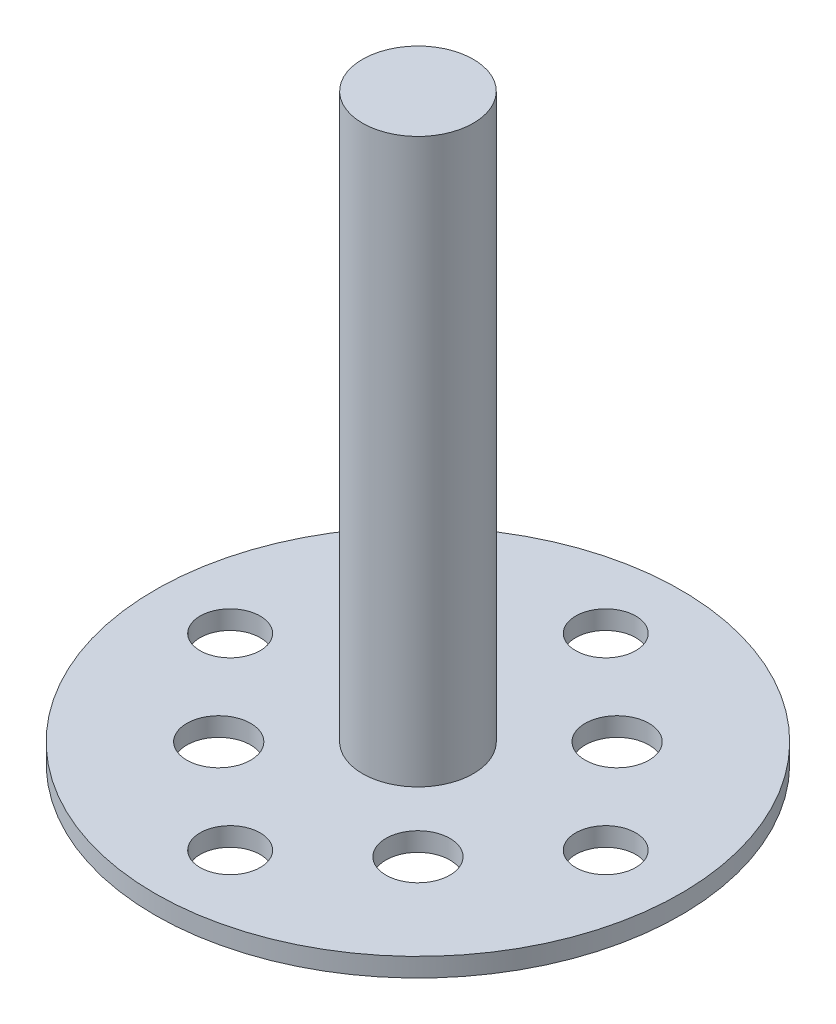
ISO-10303-21;
HEADER;
FILE_DESCRIPTION(('STEP AP214'),'2;1');
FILE_NAME('part.step','',(''),(''),'','','');
FILE_SCHEMA(('AUTOMOTIVE_DESIGN { 1 0 10303 214 1 1 1 1 }'));
ENDSEC;
DATA;
#1=APPLICATION_CONTEXT('core data for automotive mechanical design processes');
#2=APPLICATION_PROTOCOL_DEFINITION('international standard','automotive_design',2000,#1);
#3=PRODUCT_CONTEXT('',#1,'mechanical');
#4=PRODUCT('Part','Part','',(#3));
#5=PRODUCT_RELATED_PRODUCT_CATEGORY('part','',(#4));
#6=PRODUCT_DEFINITION_FORMATION('','',#4);
#7=PRODUCT_DEFINITION_CONTEXT('part definition',#1,'design');
#8=PRODUCT_DEFINITION('design','',#6,#7);
#9=PRODUCT_DEFINITION_SHAPE('','',#8);
#10=(LENGTH_UNIT() NAMED_UNIT(*) SI_UNIT(.MILLI.,.METRE.));
#11=(NAMED_UNIT(*) PLANE_ANGLE_UNIT() SI_UNIT($,.RADIAN.));
#12=(NAMED_UNIT(*) SI_UNIT($,.STERADIAN.) SOLID_ANGLE_UNIT());
#13=UNCERTAINTY_MEASURE_WITH_UNIT(LENGTH_MEASURE(1.E-05),#10,'distance_accuracy_value','');
#14=(GEOMETRIC_REPRESENTATION_CONTEXT(3) GLOBAL_UNCERTAINTY_ASSIGNED_CONTEXT((#13)) GLOBAL_UNIT_ASSIGNED_CONTEXT((#10,
#11,#12)) REPRESENTATION_CONTEXT('',''));
#15=CARTESIAN_POINT('',(0.,0.,0.));
#16=DIRECTION('',(0.,0.,1.));
#17=DIRECTION('',(1.,0.,0.));
#18=AXIS2_PLACEMENT_3D('',#15,#16,#17);
#19=CARTESIAN_POINT('',(-5.30330085889941,1.,-5.3033008588988));
#20=DIRECTION('',(0.,-1.,0.));
#21=DIRECTION('',(0.,0.,-1.));
#22=AXIS2_PLACEMENT_3D('',#19,#20,#21);
#23=CYLINDRICAL_SURFACE('',#22,1.7);
#24=CARTESIAN_POINT('',(-5.30330085889941,1.,-5.3033008588988));
#25=DIRECTION('',(0.,1.,0.));
#26=DIRECTION('',(0.,0.,1.));
#27=AXIS2_PLACEMENT_3D('',#24,#25,#26);
#28=CIRCLE('',#27,1.7);
#29=CARTESIAN_POINT('',(-5.30330085889941,1.,-3.6033008588988));
#30=VERTEX_POINT('',#29);
#31=EDGE_CURVE('E54',#30,#30,#28,.T.);
#32=ORIENTED_EDGE('',*,*,#31,.T.);
#33=EDGE_LOOP('',(#32));
#34=FACE_BOUND('',#33,.T.);
#35=CARTESIAN_POINT('',(-5.30330085889941,0.,-5.3033008588988));
#36=DIRECTION('',(0.,1.,0.));
#37=DIRECTION('',(0.,0.,1.));
#38=AXIS2_PLACEMENT_3D('',#35,#36,#37);
#39=CIRCLE('',#38,1.7);
#40=CARTESIAN_POINT('',(-5.30330085889941,0.,-3.6033008588988));
#41=VERTEX_POINT('',#40);
#42=EDGE_CURVE('E92',#41,#41,#39,.T.);
#43=ORIENTED_EDGE('',*,*,#42,.F.);
#44=EDGE_LOOP('',(#43));
#45=FACE_BOUND('',#44,.T.);
#46=ADVANCED_FACE('F45',(#34,#45),#23,.F.);
#47=CARTESIAN_POINT('',(-5.3033008588988,1.,5.30330085889941));
#48=DIRECTION('',(0.,-1.,0.));
#49=DIRECTION('',(0.,0.,-1.));
#50=AXIS2_PLACEMENT_3D('',#47,#48,#49);
#51=CYLINDRICAL_SURFACE('',#50,1.7);
#52=CARTESIAN_POINT('',(-5.3033008588988,1.,5.30330085889941));
#53=DIRECTION('',(0.,1.,0.));
#54=DIRECTION('',(0.,0.,1.));
#55=AXIS2_PLACEMENT_3D('',#52,#53,#54);
#56=CIRCLE('',#55,1.7);
#57=CARTESIAN_POINT('',(-5.3033008588988,1.,7.00330085889942));
#58=VERTEX_POINT('',#57);
#59=EDGE_CURVE('E60',#58,#58,#56,.T.);
#60=ORIENTED_EDGE('',*,*,#59,.T.);
#61=EDGE_LOOP('',(#60));
#62=FACE_BOUND('',#61,.T.);
#63=CARTESIAN_POINT('',(-5.3033008588988,0.,5.30330085889941));
#64=DIRECTION('',(0.,1.,0.));
#65=DIRECTION('',(0.,0.,1.));
#66=AXIS2_PLACEMENT_3D('',#63,#64,#65);
#67=CIRCLE('',#66,1.7);
#68=CARTESIAN_POINT('',(-5.3033008588988,0.,7.00330085889942));
#69=VERTEX_POINT('',#68);
#70=EDGE_CURVE('E89',#69,#69,#67,.T.);
#71=ORIENTED_EDGE('',*,*,#70,.F.);
#72=EDGE_LOOP('',(#71));
#73=FACE_BOUND('',#72,.T.);
#74=ADVANCED_FACE('F136',(#62,#73),#51,.F.);
#75=CARTESIAN_POINT('',(5.30330085889941,1.,-5.3033008588988));
#76=DIRECTION('',(0.,-1.,0.));
#77=DIRECTION('',(0.,0.,-1.));
#78=AXIS2_PLACEMENT_3D('',#75,#76,#77);
#79=CYLINDRICAL_SURFACE('',#78,1.7);
#80=CARTESIAN_POINT('',(5.30330085889941,1.,-5.3033008588988));
#81=DIRECTION('',(0.,1.,0.));
#82=DIRECTION('',(0.,0.,1.));
#83=AXIS2_PLACEMENT_3D('',#80,#81,#82);
#84=CIRCLE('',#83,1.7);
#85=CARTESIAN_POINT('',(5.30330085889941,1.,-3.6033008588988));
#86=VERTEX_POINT('',#85);
#87=EDGE_CURVE('E129',#86,#86,#84,.F.);
#88=ORIENTED_EDGE('',*,*,#87,.F.);
#89=EDGE_LOOP('',(#88));
#90=FACE_BOUND('',#89,.T.);
#91=CARTESIAN_POINT('',(5.30330085889941,0.,-5.3033008588988));
#92=DIRECTION('',(0.,1.,0.));
#93=DIRECTION('',(0.,0.,1.));
#94=AXIS2_PLACEMENT_3D('',#91,#92,#93);
#95=CIRCLE('',#94,1.7);
#96=CARTESIAN_POINT('',(5.30330085889941,0.,-3.6033008588988));
#97=VERTEX_POINT('',#96);
#98=EDGE_CURVE('E85',#97,#97,#95,.F.);
#99=ORIENTED_EDGE('',*,*,#98,.T.);
#100=EDGE_LOOP('',(#99));
#101=FACE_BOUND('',#100,.T.);
#102=ADVANCED_FACE('F154',(#90,#101),#79,.F.);
#103=CARTESIAN_POINT('',(0.,1.,0.));
#104=DIRECTION('',(0.,-1.,0.));
#105=DIRECTION('',(0.,0.,-1.));
#106=AXIS2_PLACEMENT_3D('',#103,#104,#105);
#107=CYLINDRICAL_SURFACE('',#106,14.);
#108=CARTESIAN_POINT('',(0.,1.,0.));
#109=DIRECTION('',(0.,1.,0.));
#110=DIRECTION('',(0.,0.,1.));
#111=AXIS2_PLACEMENT_3D('',#108,#109,#110);
#112=CIRCLE('',#111,14.);
#113=CARTESIAN_POINT('',(0.,1.,14.));
#114=VERTEX_POINT('',#113);
#115=EDGE_CURVE('E121',#114,#114,#112,.T.);
#116=ORIENTED_EDGE('',*,*,#115,.F.);
#117=EDGE_LOOP('',(#116));
#118=FACE_BOUND('',#117,.T.);
#119=CARTESIAN_POINT('',(0.,0.,0.));
#120=DIRECTION('',(0.,1.,0.));
#121=DIRECTION('',(0.,0.,1.));
#122=AXIS2_PLACEMENT_3D('',#119,#120,#121);
#123=CIRCLE('',#122,14.);
#124=CARTESIAN_POINT('',(0.,0.,14.));
#125=VERTEX_POINT('',#124);
#126=EDGE_CURVE('E81',#125,#125,#123,.T.);
#127=ORIENTED_EDGE('',*,*,#126,.T.);
#128=EDGE_LOOP('',(#127));
#129=FACE_BOUND('',#128,.T.);
#130=ADVANCED_FACE('F161',(#118,#129),#107,.T.);
#131=CARTESIAN_POINT('',(0.,1.,10.0000000000011));
#132=DIRECTION('',(0.,-1.,0.));
#133=DIRECTION('',(0.,0.,-1.));
#134=AXIS2_PLACEMENT_3D('',#131,#132,#133);
#135=CYLINDRICAL_SURFACE('',#134,1.59999999999974);
#136=CARTESIAN_POINT('',(0.,1.,10.0000000000011));
#137=DIRECTION('',(0.,1.,0.));
#138=DIRECTION('',(0.,0.,1.));
#139=AXIS2_PLACEMENT_3D('',#136,#137,#138);
#140=CIRCLE('',#139,1.59999999999974);
#141=CARTESIAN_POINT('',(0.,1.,11.6000000000009));
#142=VERTEX_POINT('',#141);
#143=EDGE_CURVE('E117',#142,#142,#140,.T.);
#144=ORIENTED_EDGE('',*,*,#143,.T.);
#145=EDGE_LOOP('',(#144));
#146=FACE_BOUND('',#145,.T.);
#147=CARTESIAN_POINT('',(0.,0.,10.0000000000011));
#148=DIRECTION('',(0.,1.,0.));
#149=DIRECTION('',(0.,0.,1.));
#150=AXIS2_PLACEMENT_3D('',#147,#148,#149);
#151=CIRCLE('',#150,1.59999999999974);
#152=CARTESIAN_POINT('',(0.,0.,11.6000000000009));
#153=VERTEX_POINT('',#152);
#154=EDGE_CURVE('E77',#153,#153,#151,.T.);
#155=ORIENTED_EDGE('',*,*,#154,.F.);
#156=EDGE_LOOP('',(#155));
#157=FACE_BOUND('',#156,.T.);
#158=ADVANCED_FACE('F165',(#146,#157),#135,.F.);
#159=CARTESIAN_POINT('',(10.0000000000006,1.,5.69056852373624E-13));
#160=DIRECTION('',(0.,-1.,0.));
#161=DIRECTION('',(0.,0.,-1.));
#162=AXIS2_PLACEMENT_3D('',#159,#160,#161);
#163=CYLINDRICAL_SURFACE('',#162,1.59999999999932);
#164=CARTESIAN_POINT('',(10.0000000000006,1.,5.69056852373624E-13));
#165=DIRECTION('',(0.,1.,0.));
#166=DIRECTION('',(0.,0.,1.));
#167=AXIS2_PLACEMENT_3D('',#164,#165,#166);
#168=CIRCLE('',#167,1.59999999999932);
#169=CARTESIAN_POINT('',(10.0000000000006,1.,1.59999999999989));
#170=VERTEX_POINT('',#169);
#171=EDGE_CURVE('E110',#170,#170,#168,.T.);
#172=ORIENTED_EDGE('',*,*,#171,.T.);
#173=EDGE_LOOP('',(#172));
#174=FACE_BOUND('',#173,.T.);
#175=CARTESIAN_POINT('',(10.0000000000006,0.,5.69056852373624E-13));
#176=DIRECTION('',(0.,1.,0.));
#177=DIRECTION('',(0.,0.,1.));
#178=AXIS2_PLACEMENT_3D('',#175,#176,#177);
#179=CIRCLE('',#178,1.59999999999932);
#180=CARTESIAN_POINT('',(10.0000000000006,0.,1.59999999999989));
#181=VERTEX_POINT('',#180);
#182=EDGE_CURVE('E73',#181,#181,#179,.T.);
#183=ORIENTED_EDGE('',*,*,#182,.F.);
#184=EDGE_LOOP('',(#183));
#185=FACE_BOUND('',#184,.T.);
#186=ADVANCED_FACE('F169',(#174,#185),#163,.F.);
#187=CARTESIAN_POINT('',(0.,1.,-10.));
#188=DIRECTION('',(0.,-1.,0.));
#189=DIRECTION('',(0.,0.,-1.));
#190=AXIS2_PLACEMENT_3D('',#187,#188,#189);
#191=CYLINDRICAL_SURFACE('',#190,1.6);
#192=CARTESIAN_POINT('',(0.,1.,-10.));
#193=DIRECTION('',(0.,1.,0.));
#194=DIRECTION('',(0.,0.,1.));
#195=AXIS2_PLACEMENT_3D('',#192,#193,#194);
#196=CIRCLE('',#195,1.6);
#197=CARTESIAN_POINT('',(0.,1.,-8.4));
#198=VERTEX_POINT('',#197);
#199=EDGE_CURVE('E104',#198,#198,#196,.T.);
#200=ORIENTED_EDGE('',*,*,#199,.T.);
#201=EDGE_LOOP('',(#200));
#202=FACE_BOUND('',#201,.T.);
#203=CARTESIAN_POINT('',(0.,0.,-10.));
#204=DIRECTION('',(0.,1.,0.));
#205=DIRECTION('',(0.,0.,1.));
#206=AXIS2_PLACEMENT_3D('',#203,#204,#205);
#207=CIRCLE('',#206,1.6);
#208=CARTESIAN_POINT('',(0.,0.,-8.4));
#209=VERTEX_POINT('',#208);
#210=EDGE_CURVE('E68',#209,#209,#207,.T.);
#211=ORIENTED_EDGE('',*,*,#210,.F.);
#212=EDGE_LOOP('',(#211));
#213=FACE_BOUND('',#212,.T.);
#214=ADVANCED_FACE('F172',(#202,#213),#191,.F.);
#215=CARTESIAN_POINT('',(-10.0000000000006,1.,5.70652797971509E-13));
#216=DIRECTION('',(0.,-1.,0.));
#217=DIRECTION('',(0.,0.,-1.));
#218=AXIS2_PLACEMENT_3D('',#215,#216,#217);
#219=CYLINDRICAL_SURFACE('',#218,1.60000000000048);
#220=CARTESIAN_POINT('',(-10.0000000000006,1.,5.70652797971509E-13));
#221=DIRECTION('',(0.,1.,0.));
#222=DIRECTION('',(0.,0.,1.));
#223=AXIS2_PLACEMENT_3D('',#220,#221,#222);
#224=CIRCLE('',#223,1.60000000000048);
#225=CARTESIAN_POINT('',(-10.0000000000006,1.,1.60000000000105));
#226=VERTEX_POINT('',#225);
#227=EDGE_CURVE('E99',#226,#226,#224,.T.);
#228=ORIENTED_EDGE('',*,*,#227,.T.);
#229=EDGE_LOOP('',(#228));
#230=FACE_BOUND('',#229,.T.);
#231=CARTESIAN_POINT('',(-10.0000000000006,0.,5.70652797971509E-13));
#232=DIRECTION('',(0.,1.,0.));
#233=DIRECTION('',(0.,0.,1.));
#234=AXIS2_PLACEMENT_3D('',#231,#232,#233);
#235=CIRCLE('',#234,1.60000000000048);
#236=CARTESIAN_POINT('',(-10.0000000000006,0.,1.60000000000105));
#237=VERTEX_POINT('',#236);
#238=EDGE_CURVE('E64',#237,#237,#235,.T.);
#239=ORIENTED_EDGE('',*,*,#238,.F.);
#240=EDGE_LOOP('',(#239));
#241=FACE_BOUND('',#240,.T.);
#242=ADVANCED_FACE('F47',(#230,#241),#219,.F.);
#243=CARTESIAN_POINT('',(5.3033008588988,1.,5.30330085889941));
#244=DIRECTION('',(0.,-1.,0.));
#245=DIRECTION('',(0.,0.,-1.));
#246=AXIS2_PLACEMENT_3D('',#243,#244,#245);
#247=CYLINDRICAL_SURFACE('',#246,1.7);
#248=CARTESIAN_POINT('',(5.3033008588988,1.,5.30330085889941));
#249=DIRECTION('',(0.,1.,0.));
#250=DIRECTION('',(0.,0.,1.));
#251=AXIS2_PLACEMENT_3D('',#248,#249,#250);
#252=CIRCLE('',#251,1.7);
#253=CARTESIAN_POINT('',(5.3033008588988,1.,7.00330085889942));
#254=VERTEX_POINT('',#253);
#255=EDGE_CURVE('E10',#254,#254,#252,.F.);
#256=ORIENTED_EDGE('',*,*,#255,.F.);
#257=EDGE_LOOP('',(#256));
#258=FACE_BOUND('',#257,.T.);
#259=CARTESIAN_POINT('',(5.3033008588988,0.,5.30330085889941));
#260=DIRECTION('',(0.,1.,0.));
#261=DIRECTION('',(0.,0.,1.));
#262=AXIS2_PLACEMENT_3D('',#259,#260,#261);
#263=CIRCLE('',#262,1.7);
#264=CARTESIAN_POINT('',(5.3033008588988,0.,7.00330085889942));
#265=VERTEX_POINT('',#264);
#266=EDGE_CURVE('E49',#265,#265,#263,.F.);
#267=ORIENTED_EDGE('',*,*,#266,.T.);
#268=EDGE_LOOP('',(#267));
#269=FACE_BOUND('',#268,.T.);
#270=ADVANCED_FACE('F143',(#258,#269),#247,.F.);
#271=CARTESIAN_POINT('',(0.,1.,0.));
#272=DIRECTION('',(0.,1.,0.));
#273=DIRECTION('',(0.,0.,1.));
#274=AXIS2_PLACEMENT_3D('',#271,#272,#273);
#275=PLANE('',#274);
#276=ORIENTED_EDGE('',*,*,#227,.F.);
#277=EDGE_LOOP('',(#276));
#278=FACE_BOUND('',#277,.T.);
#279=ORIENTED_EDGE('',*,*,#199,.F.);
#280=EDGE_LOOP('',(#279));
#281=FACE_BOUND('',#280,.T.);
#282=ORIENTED_EDGE('',*,*,#171,.F.);
#283=EDGE_LOOP('',(#282));
#284=FACE_BOUND('',#283,.T.);
#285=ORIENTED_EDGE('',*,*,#143,.F.);
#286=EDGE_LOOP('',(#285));
#287=FACE_BOUND('',#286,.T.);
#288=ORIENTED_EDGE('',*,*,#115,.T.);
#289=EDGE_LOOP('',(#288));
#290=FACE_BOUND('',#289,.T.);
#291=CARTESIAN_POINT('',(0.,1.,0.));
#292=DIRECTION('',(0.,1.,0.));
#293=DIRECTION('',(0.,0.,1.));
#294=AXIS2_PLACEMENT_3D('',#291,#292,#293);
#295=CIRCLE('',#294,2.95);
#296=CARTESIAN_POINT('',(0.,1.,2.95));
#297=VERTEX_POINT('',#296);
#298=EDGE_CURVE('E125',#297,#297,#295,.T.);
#299=ORIENTED_EDGE('',*,*,#298,.F.);
#300=EDGE_LOOP('',(#299));
#301=FACE_BOUND('',#300,.T.);
#302=ORIENTED_EDGE('',*,*,#87,.T.);
#303=EDGE_LOOP('',(#302));
#304=FACE_BOUND('',#303,.T.);
#305=ORIENTED_EDGE('',*,*,#59,.F.);
#306=EDGE_LOOP('',(#305));
#307=FACE_BOUND('',#306,.T.);
#308=ORIENTED_EDGE('',*,*,#31,.F.);
#309=EDGE_LOOP('',(#308));
#310=FACE_BOUND('',#309,.T.);
#311=ORIENTED_EDGE('',*,*,#255,.T.);
#312=EDGE_LOOP('',(#311));
#313=FACE_BOUND('',#312,.T.);
#314=ADVANCED_FACE('F139',(#278,#281,#284,#287,#290,#301,#304,#307,#310,#313),#275,.T.);
#315=CARTESIAN_POINT('',(0.,0.,0.));
#316=DIRECTION('',(0.,1.,0.));
#317=DIRECTION('',(0.,0.,1.));
#318=AXIS2_PLACEMENT_3D('',#315,#316,#317);
#319=PLANE('',#318);
#320=ORIENTED_EDGE('',*,*,#238,.T.);
#321=EDGE_LOOP('',(#320));
#322=FACE_BOUND('',#321,.T.);
#323=ORIENTED_EDGE('',*,*,#210,.T.);
#324=EDGE_LOOP('',(#323));
#325=FACE_BOUND('',#324,.T.);
#326=ORIENTED_EDGE('',*,*,#182,.T.);
#327=EDGE_LOOP('',(#326));
#328=FACE_BOUND('',#327,.T.);
#329=ORIENTED_EDGE('',*,*,#154,.T.);
#330=EDGE_LOOP('',(#329));
#331=FACE_BOUND('',#330,.T.);
#332=ORIENTED_EDGE('',*,*,#126,.F.);
#333=EDGE_LOOP('',(#332));
#334=FACE_BOUND('',#333,.T.);
#335=ORIENTED_EDGE('',*,*,#98,.F.);
#336=EDGE_LOOP('',(#335));
#337=FACE_BOUND('',#336,.T.);
#338=ORIENTED_EDGE('',*,*,#70,.T.);
#339=EDGE_LOOP('',(#338));
#340=FACE_BOUND('',#339,.T.);
#341=ORIENTED_EDGE('',*,*,#42,.T.);
#342=EDGE_LOOP('',(#341));
#343=FACE_BOUND('',#342,.T.);
#344=ORIENTED_EDGE('',*,*,#266,.F.);
#345=EDGE_LOOP('',(#344));
#346=FACE_BOUND('',#345,.T.);
#347=ADVANCED_FACE('F142',(#322,#325,#328,#331,#334,#337,#340,#343,#346),#319,.F.);
#348=CARTESIAN_POINT('',(0.,31.,0.));
#349=DIRECTION('',(0.,-1.,0.));
#350=DIRECTION('',(0.,0.,-1.));
#351=AXIS2_PLACEMENT_3D('',#348,#349,#350);
#352=CYLINDRICAL_SURFACE('',#351,2.95);
#353=ORIENTED_EDGE('',*,*,#298,.T.);
#354=EDGE_LOOP('',(#353));
#355=FACE_BOUND('',#354,.T.);
#356=CARTESIAN_POINT('',(0.,31.,0.));
#357=DIRECTION('',(0.,1.,0.));
#358=DIRECTION('',(0.,0.,1.));
#359=AXIS2_PLACEMENT_3D('',#356,#357,#358);
#360=CIRCLE('',#359,2.95);
#361=CARTESIAN_POINT('',(0.,31.,2.95));
#362=VERTEX_POINT('',#361);
#363=EDGE_CURVE('E69',#362,#362,#360,.T.);
#364=ORIENTED_EDGE('',*,*,#363,.F.);
#365=EDGE_LOOP('',(#364));
#366=FACE_BOUND('',#365,.T.);
#367=ADVANCED_FACE('F185',(#355,#366),#352,.T.);
#368=CARTESIAN_POINT('',(0.,31.,0.));
#369=DIRECTION('',(0.,1.,0.));
#370=DIRECTION('',(0.,0.,1.));
#371=AXIS2_PLACEMENT_3D('',#368,#369,#370);
#372=PLANE('',#371);
#373=ORIENTED_EDGE('',*,*,#363,.T.);
#374=EDGE_LOOP('',(#373));
#375=FACE_BOUND('',#374,.T.);
#376=ADVANCED_FACE('F204',(#375),#372,.T.);
#377=CLOSED_SHELL('',(#46,#74,#102,#130,#158,#186,#214,#242,#270,#314,#347,#367,#376));
#378=MANIFOLD_SOLID_BREP('B2',#377);
#379=ADVANCED_BREP_SHAPE_REPRESENTATION('',(#18,#378),#14);
#380=SHAPE_DEFINITION_REPRESENTATION(#9,#379);
ENDSEC;
END-ISO-10303-21;
